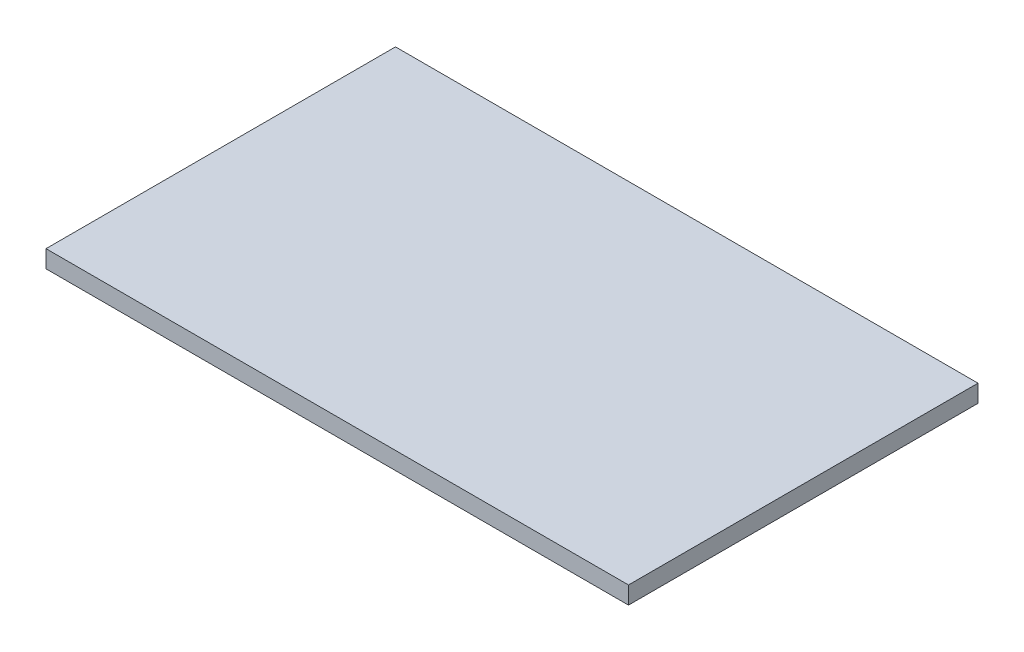
ISO-10303-21;
HEADER;
FILE_DESCRIPTION(('STEP AP214'),'2;1');
FILE_NAME('part.step','',(''),(''),'','','');
FILE_SCHEMA(('AUTOMOTIVE_DESIGN { 1 0 10303 214 1 1 1 1 }'));
ENDSEC;
DATA;
#1=APPLICATION_CONTEXT('core data for automotive mechanical design processes');
#2=APPLICATION_PROTOCOL_DEFINITION('international standard','automotive_design',2000,#1);
#3=PRODUCT_CONTEXT('',#1,'mechanical');
#4=PRODUCT('Part','Part','',(#3));
#5=PRODUCT_RELATED_PRODUCT_CATEGORY('part','',(#4));
#6=PRODUCT_DEFINITION_FORMATION('','',#4);
#7=PRODUCT_DEFINITION_CONTEXT('part definition',#1,'design');
#8=PRODUCT_DEFINITION('design','',#6,#7);
#9=PRODUCT_DEFINITION_SHAPE('','',#8);
#10=(LENGTH_UNIT() NAMED_UNIT(*) SI_UNIT(.MILLI.,.METRE.));
#11=(NAMED_UNIT(*) PLANE_ANGLE_UNIT() SI_UNIT($,.RADIAN.));
#12=(NAMED_UNIT(*) SI_UNIT($,.STERADIAN.) SOLID_ANGLE_UNIT());
#13=UNCERTAINTY_MEASURE_WITH_UNIT(LENGTH_MEASURE(1.E-05),#10,'distance_accuracy_value','');
#14=(GEOMETRIC_REPRESENTATION_CONTEXT(3) GLOBAL_UNCERTAINTY_ASSIGNED_CONTEXT((#13)) GLOBAL_UNIT_ASSIGNED_CONTEXT((#10,
#11,#12)) REPRESENTATION_CONTEXT('',''));
#15=CARTESIAN_POINT('',(0.,0.,0.));
#16=DIRECTION('',(0.,0.,1.));
#17=DIRECTION('',(1.,0.,0.));
#18=AXIS2_PLACEMENT_3D('',#15,#16,#17);
#19=CARTESIAN_POINT('',(-50.,3.,-30.));
#20=DIRECTION('',(1.,0.,0.));
#21=DIRECTION('',(0.,0.,-1.));
#22=AXIS2_PLACEMENT_3D('',#19,#20,#21);
#23=PLANE('',#22);
#24=DIRECTION('',(0.,0.,1.));
#25=VECTOR('',#24,1.);
#26=CARTESIAN_POINT('',(-50.,0.,-30.));
#27=LINE('',#26,#25);
#28=CARTESIAN_POINT('',(-50.,0.,-30.));
#29=VERTEX_POINT('',#28);
#30=CARTESIAN_POINT('',(-50.,0.,30.));
#31=VERTEX_POINT('',#30);
#32=EDGE_CURVE('E96',#29,#31,#27,.T.);
#33=ORIENTED_EDGE('',*,*,#32,.T.);
#34=DIRECTION('',(0.,-1.,0.));
#35=VECTOR('',#34,1.);
#36=CARTESIAN_POINT('',(-50.,3.,30.));
#37=LINE('',#36,#35);
#38=CARTESIAN_POINT('',(-50.,3.,30.));
#39=VERTEX_POINT('',#38);
#40=EDGE_CURVE('E11',#39,#31,#37,.T.);
#41=ORIENTED_EDGE('',*,*,#40,.F.);
#42=DIRECTION('',(0.,0.,1.));
#43=VECTOR('',#42,1.);
#44=CARTESIAN_POINT('',(-50.,3.,-30.));
#45=LINE('',#44,#43);
#46=CARTESIAN_POINT('',(-50.,3.,-30.));
#47=VERTEX_POINT('',#46);
#48=EDGE_CURVE('E84',#47,#39,#45,.T.);
#49=ORIENTED_EDGE('',*,*,#48,.F.);
#50=DIRECTION('',(0.,-1.,0.));
#51=VECTOR('',#50,1.);
#52=CARTESIAN_POINT('',(-50.,3.,-30.));
#53=LINE('',#52,#51);
#54=EDGE_CURVE('E92',#47,#29,#53,.T.);
#55=ORIENTED_EDGE('',*,*,#54,.T.);
#56=EDGE_LOOP('',(#33,#41,#49,#55));
#57=FACE_BOUND('',#56,.T.);
#58=ADVANCED_FACE('F33',(#57),#23,.F.);
#59=CARTESIAN_POINT('',(-50.,3.,30.));
#60=DIRECTION('',(0.,0.,-1.));
#61=DIRECTION('',(-1.,0.,0.));
#62=AXIS2_PLACEMENT_3D('',#59,#60,#61);
#63=PLANE('',#62);
#64=DIRECTION('',(1.,0.,0.));
#65=VECTOR('',#64,1.);
#66=CARTESIAN_POINT('',(-50.,0.,30.));
#67=LINE('',#66,#65);
#68=CARTESIAN_POINT('',(50.,0.,30.));
#69=VERTEX_POINT('',#68);
#70=EDGE_CURVE('E88',#31,#69,#67,.T.);
#71=ORIENTED_EDGE('',*,*,#70,.T.);
#72=DIRECTION('',(0.,-1.,0.));
#73=VECTOR('',#72,1.);
#74=CARTESIAN_POINT('',(50.,3.,30.));
#75=LINE('',#74,#73);
#76=CARTESIAN_POINT('',(50.,3.,30.));
#77=VERTEX_POINT('',#76);
#78=EDGE_CURVE('E41',#77,#69,#75,.T.);
#79=ORIENTED_EDGE('',*,*,#78,.F.);
#80=DIRECTION('',(1.,0.,0.));
#81=VECTOR('',#80,1.);
#82=CARTESIAN_POINT('',(-50.,3.,30.));
#83=LINE('',#82,#81);
#84=EDGE_CURVE('E79',#39,#77,#83,.T.);
#85=ORIENTED_EDGE('',*,*,#84,.F.);
#86=ORIENTED_EDGE('',*,*,#40,.T.);
#87=EDGE_LOOP('',(#71,#79,#85,#86));
#88=FACE_BOUND('',#87,.T.);
#89=ADVANCED_FACE('F87',(#88),#63,.F.);
#90=CARTESIAN_POINT('',(50.,3.,-30.));
#91=DIRECTION('',(-1.,0.,0.));
#92=DIRECTION('',(0.,0.,1.));
#93=AXIS2_PLACEMENT_3D('',#90,#91,#92);
#94=PLANE('',#93);
#95=DIRECTION('',(0.,0.,-1.));
#96=VECTOR('',#95,1.);
#97=CARTESIAN_POINT('',(50.,0.,-30.));
#98=LINE('',#97,#96);
#99=CARTESIAN_POINT('',(50.,0.,-30.));
#100=VERTEX_POINT('',#99);
#101=EDGE_CURVE('E66',#69,#100,#98,.T.);
#102=ORIENTED_EDGE('',*,*,#101,.T.);
#103=DIRECTION('',(0.,-1.,0.));
#104=VECTOR('',#103,1.);
#105=CARTESIAN_POINT('',(50.,3.,-30.));
#106=LINE('',#105,#104);
#107=CARTESIAN_POINT('',(50.,3.,-30.));
#108=VERTEX_POINT('',#107);
#109=EDGE_CURVE('E89',#108,#100,#106,.T.);
#110=ORIENTED_EDGE('',*,*,#109,.F.);
#111=DIRECTION('',(0.,0.,-1.));
#112=VECTOR('',#111,1.);
#113=CARTESIAN_POINT('',(50.,3.,-30.));
#114=LINE('',#113,#112);
#115=EDGE_CURVE('E82',#77,#108,#114,.T.);
#116=ORIENTED_EDGE('',*,*,#115,.F.);
#117=ORIENTED_EDGE('',*,*,#78,.T.);
#118=EDGE_LOOP('',(#102,#110,#116,#117));
#119=FACE_BOUND('',#118,.T.);
#120=ADVANCED_FACE('F90',(#119),#94,.F.);
#121=CARTESIAN_POINT('',(-50.,3.,-30.));
#122=DIRECTION('',(0.,0.,1.));
#123=DIRECTION('',(1.,0.,0.));
#124=AXIS2_PLACEMENT_3D('',#121,#122,#123);
#125=PLANE('',#124);
#126=DIRECTION('',(-1.,0.,0.));
#127=VECTOR('',#126,1.);
#128=CARTESIAN_POINT('',(-50.,0.,-30.));
#129=LINE('',#128,#127);
#130=EDGE_CURVE('E72',#100,#29,#129,.T.);
#131=ORIENTED_EDGE('',*,*,#130,.T.);
#132=ORIENTED_EDGE('',*,*,#54,.F.);
#133=DIRECTION('',(-1.,0.,0.));
#134=VECTOR('',#133,1.);
#135=CARTESIAN_POINT('',(-50.,3.,-30.));
#136=LINE('',#135,#134);
#137=EDGE_CURVE('E49',#108,#47,#136,.T.);
#138=ORIENTED_EDGE('',*,*,#137,.F.);
#139=ORIENTED_EDGE('',*,*,#109,.T.);
#140=EDGE_LOOP('',(#131,#132,#138,#139));
#141=FACE_BOUND('',#140,.T.);
#142=ADVANCED_FACE('F103',(#141),#125,.F.);
#143=CARTESIAN_POINT('',(0.,3.,0.));
#144=DIRECTION('',(0.,1.,0.));
#145=DIRECTION('',(0.,0.,1.));
#146=AXIS2_PLACEMENT_3D('',#143,#144,#145);
#147=PLANE('',#146);
#148=ORIENTED_EDGE('',*,*,#48,.T.);
#149=ORIENTED_EDGE('',*,*,#84,.T.);
#150=ORIENTED_EDGE('',*,*,#115,.T.);
#151=ORIENTED_EDGE('',*,*,#137,.T.);
#152=EDGE_LOOP('',(#148,#149,#150,#151));
#153=FACE_BOUND('',#152,.T.);
#154=ADVANCED_FACE('F80',(#153),#147,.T.);
#155=CARTESIAN_POINT('',(0.,0.,0.));
#156=DIRECTION('',(0.,1.,0.));
#157=DIRECTION('',(0.,0.,1.));
#158=AXIS2_PLACEMENT_3D('',#155,#156,#157);
#159=PLANE('',#158);
#160=ORIENTED_EDGE('',*,*,#32,.F.);
#161=ORIENTED_EDGE('',*,*,#130,.F.);
#162=ORIENTED_EDGE('',*,*,#101,.F.);
#163=ORIENTED_EDGE('',*,*,#70,.F.);
#164=EDGE_LOOP('',(#160,#161,#162,#163));
#165=FACE_BOUND('',#164,.T.);
#166=ADVANCED_FACE('F106',(#165),#159,.F.);
#167=CLOSED_SHELL('',(#58,#89,#120,#142,#154,#166));
#168=MANIFOLD_SOLID_BREP('B2',#167);
#169=ADVANCED_BREP_SHAPE_REPRESENTATION('',(#18,#168),#14);
#170=SHAPE_DEFINITION_REPRESENTATION(#9,#169);
ENDSEC;
END-ISO-10303-21;
